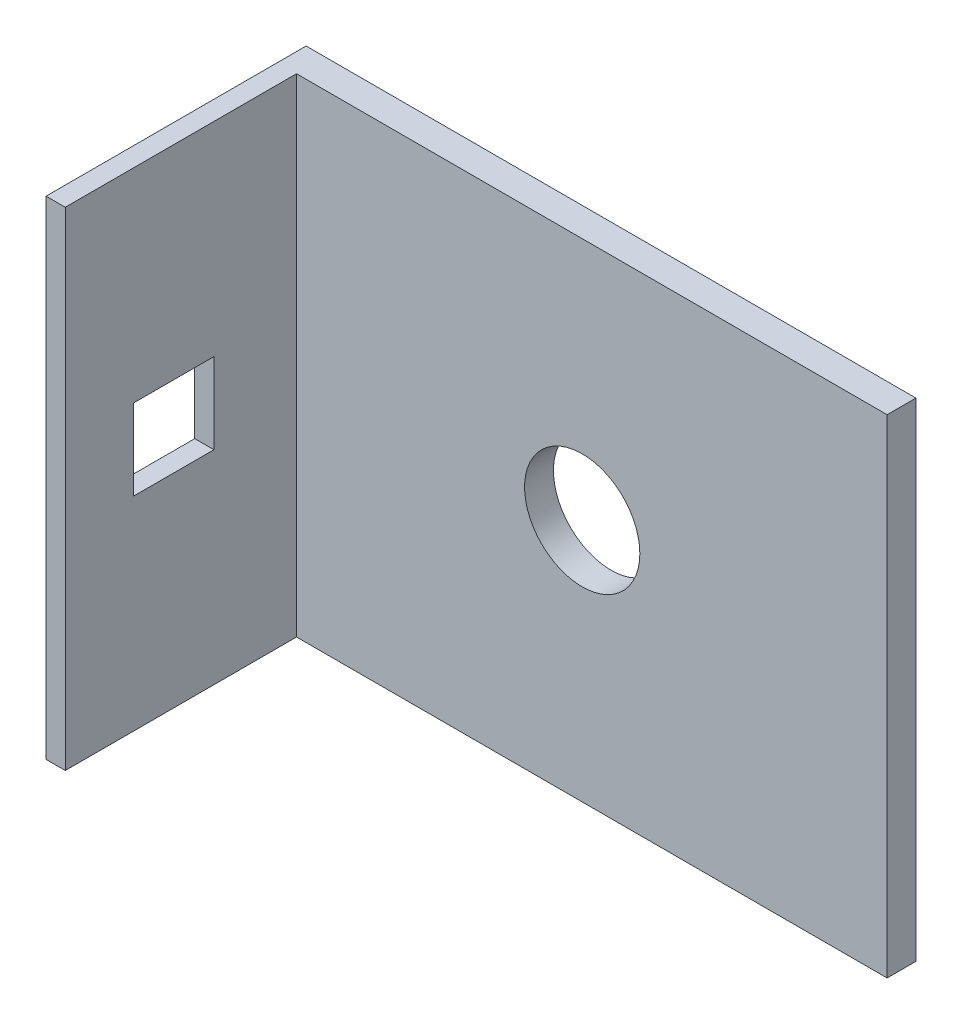
ISO-10303-21;
HEADER;
FILE_DESCRIPTION(('STEP AP214'),'2;1');
FILE_NAME('part.step','',(''),(''),'','','');
FILE_SCHEMA(('AUTOMOTIVE_DESIGN { 1 0 10303 214 1 1 1 1 }'));
ENDSEC;
DATA;
#1=APPLICATION_CONTEXT('core data for automotive mechanical design processes');
#2=APPLICATION_PROTOCOL_DEFINITION('international standard','automotive_design',2000,#1);
#3=PRODUCT_CONTEXT('',#1,'mechanical');
#4=PRODUCT('Part','Part','',(#3));
#5=PRODUCT_RELATED_PRODUCT_CATEGORY('part','',(#4));
#6=PRODUCT_DEFINITION_FORMATION('','',#4);
#7=PRODUCT_DEFINITION_CONTEXT('part definition',#1,'design');
#8=PRODUCT_DEFINITION('design','',#6,#7);
#9=PRODUCT_DEFINITION_SHAPE('','',#8);
#10=(LENGTH_UNIT() NAMED_UNIT(*) SI_UNIT(.MILLI.,.METRE.));
#11=(NAMED_UNIT(*) PLANE_ANGLE_UNIT() SI_UNIT($,.RADIAN.));
#12=(NAMED_UNIT(*) SI_UNIT($,.STERADIAN.) SOLID_ANGLE_UNIT());
#13=UNCERTAINTY_MEASURE_WITH_UNIT(LENGTH_MEASURE(1.E-05),#10,'distance_accuracy_value','');
#14=(GEOMETRIC_REPRESENTATION_CONTEXT(3) GLOBAL_UNCERTAINTY_ASSIGNED_CONTEXT((#13)) GLOBAL_UNIT_ASSIGNED_CONTEXT((#10,
#11,#12)) REPRESENTATION_CONTEXT('',''));
#15=CARTESIAN_POINT('',(0.,0.,0.));
#16=DIRECTION('',(0.,0.,1.));
#17=DIRECTION('',(1.,0.,0.));
#18=AXIS2_PLACEMENT_3D('',#15,#16,#17);
#19=CARTESIAN_POINT('',(0.,0.,3.));
#20=DIRECTION('',(0.,0.,1.));
#21=DIRECTION('',(1.,0.,0.));
#22=AXIS2_PLACEMENT_3D('',#19,#20,#21);
#23=PLANE('',#22);
#24=DIRECTION('',(0.,1.,0.));
#25=VECTOR('',#24,1.);
#26=CARTESIAN_POINT('',(-29.75,25.4,3.));
#27=LINE('',#26,#25);
#28=CARTESIAN_POINT('',(-29.75,-25.4,3.));
#29=VERTEX_POINT('',#28);
#30=CARTESIAN_POINT('',(-29.75,25.4,3.));
#31=VERTEX_POINT('',#30);
#32=EDGE_CURVE('E158',#29,#31,#27,.T.);
#33=ORIENTED_EDGE('',*,*,#32,.F.);
#34=DIRECTION('',(1.,0.,0.));
#35=VECTOR('',#34,1.);
#36=CARTESIAN_POINT('',(-31.75,-25.4,3.));
#37=LINE('',#36,#35);
#38=CARTESIAN_POINT('',(31.75,-25.4,3.));
#39=VERTEX_POINT('',#38);
#40=EDGE_CURVE('E194',#29,#39,#37,.T.);
#41=ORIENTED_EDGE('',*,*,#40,.T.);
#42=DIRECTION('',(0.,1.,0.));
#43=VECTOR('',#42,1.);
#44=CARTESIAN_POINT('',(31.75,25.4,3.));
#45=LINE('',#44,#43);
#46=CARTESIAN_POINT('',(31.75,25.4,3.));
#47=VERTEX_POINT('',#46);
#48=EDGE_CURVE('E197',#39,#47,#45,.T.);
#49=ORIENTED_EDGE('',*,*,#48,.T.);
#50=DIRECTION('',(-1.,0.,0.));
#51=VECTOR('',#50,1.);
#52=CARTESIAN_POINT('',(-31.75,25.4,3.));
#53=LINE('',#52,#51);
#54=EDGE_CURVE('E201',#47,#31,#53,.T.);
#55=ORIENTED_EDGE('',*,*,#54,.T.);
#56=EDGE_LOOP('',(#33,#41,#49,#55));
#57=FACE_BOUND('',#56,.T.);
#58=CARTESIAN_POINT('',(0.,0.,3.));
#59=DIRECTION('',(0.,0.,1.));
#60=DIRECTION('',(1.,0.,0.));
#61=AXIS2_PLACEMENT_3D('',#58,#59,#60);
#62=CIRCLE('',#61,6.);
#63=CARTESIAN_POINT('',(6.,0.,3.));
#64=VERTEX_POINT('',#63);
#65=EDGE_CURVE('E186',#64,#64,#62,.T.);
#66=ORIENTED_EDGE('',*,*,#65,.F.);
#67=EDGE_LOOP('',(#66));
#68=FACE_BOUND('',#67,.T.);
#69=ADVANCED_FACE('F43',(#57,#68),#23,.T.);
#70=CARTESIAN_POINT('',(0.,0.,0.));
#71=DIRECTION('',(0.,0.,1.));
#72=DIRECTION('',(1.,0.,0.));
#73=AXIS2_PLACEMENT_3D('',#70,#71,#72);
#74=PLANE('',#73);
#75=DIRECTION('',(0.,-1.,0.));
#76=VECTOR('',#75,1.);
#77=CARTESIAN_POINT('',(-31.75,25.4,0.));
#78=LINE('',#77,#76);
#79=CARTESIAN_POINT('',(-31.75,25.4,0.));
#80=VERTEX_POINT('',#79);
#81=CARTESIAN_POINT('',(-31.75,-25.4,0.));
#82=VERTEX_POINT('',#81);
#83=EDGE_CURVE('E190',#80,#82,#78,.T.);
#84=ORIENTED_EDGE('',*,*,#83,.F.);
#85=DIRECTION('',(-1.,0.,0.));
#86=VECTOR('',#85,1.);
#87=CARTESIAN_POINT('',(-31.75,25.4,0.));
#88=LINE('',#87,#86);
#89=CARTESIAN_POINT('',(31.75,25.4,0.));
#90=VERTEX_POINT('',#89);
#91=EDGE_CURVE('E198',#90,#80,#88,.T.);
#92=ORIENTED_EDGE('',*,*,#91,.F.);
#93=DIRECTION('',(0.,1.,0.));
#94=VECTOR('',#93,1.);
#95=CARTESIAN_POINT('',(31.75,25.4,0.));
#96=LINE('',#95,#94);
#97=CARTESIAN_POINT('',(31.75,-25.4,0.));
#98=VERTEX_POINT('',#97);
#99=EDGE_CURVE('E211',#98,#90,#96,.T.);
#100=ORIENTED_EDGE('',*,*,#99,.F.);
#101=DIRECTION('',(1.,0.,0.));
#102=VECTOR('',#101,1.);
#103=CARTESIAN_POINT('',(-31.75,-25.4,0.));
#104=LINE('',#103,#102);
#105=EDGE_CURVE('E208',#82,#98,#104,.T.);
#106=ORIENTED_EDGE('',*,*,#105,.F.);
#107=EDGE_LOOP('',(#84,#92,#100,#106));
#108=FACE_BOUND('',#107,.T.);
#109=CARTESIAN_POINT('',(0.,0.,0.));
#110=DIRECTION('',(0.,0.,1.));
#111=DIRECTION('',(1.,0.,0.));
#112=AXIS2_PLACEMENT_3D('',#109,#110,#111);
#113=CIRCLE('',#112,6.);
#114=CARTESIAN_POINT('',(6.,0.,0.));
#115=VERTEX_POINT('',#114);
#116=EDGE_CURVE('E185',#115,#115,#113,.T.);
#117=ORIENTED_EDGE('',*,*,#116,.T.);
#118=EDGE_LOOP('',(#117));
#119=FACE_BOUND('',#118,.T.);
#120=ADVANCED_FACE('F235',(#108,#119),#74,.F.);
#121=CARTESIAN_POINT('',(-31.75,25.4,3.));
#122=DIRECTION('',(1.,0.,0.));
#123=DIRECTION('',(0.,1.,0.));
#124=AXIS2_PLACEMENT_3D('',#121,#122,#123);
#125=PLANE('',#124);
#126=DIRECTION('',(0.,0.,-1.));
#127=VECTOR('',#126,1.);
#128=CARTESIAN_POINT('',(-31.75,4.191,20.));
#129=LINE('',#128,#127);
#130=CARTESIAN_POINT('',(-31.75,4.191,20.));
#131=VERTEX_POINT('',#130);
#132=CARTESIAN_POINT('',(-31.75,4.191,11.6));
#133=VERTEX_POINT('',#132);
#134=EDGE_CURVE('E134',#131,#133,#129,.T.);
#135=ORIENTED_EDGE('',*,*,#134,.F.);
#136=DIRECTION('',(0.,1.,0.));
#137=VECTOR('',#136,1.);
#138=CARTESIAN_POINT('',(-31.75,4.191,20.));
#139=LINE('',#138,#137);
#140=CARTESIAN_POINT('',(-31.75,-4.209,20.));
#141=VERTEX_POINT('',#140);
#142=EDGE_CURVE('E59',#141,#131,#139,.T.);
#143=ORIENTED_EDGE('',*,*,#142,.F.);
#144=DIRECTION('',(0.,0.,1.));
#145=VECTOR('',#144,1.);
#146=CARTESIAN_POINT('',(-31.75,-4.209,20.));
#147=LINE('',#146,#145);
#148=CARTESIAN_POINT('',(-31.75,-4.209,11.6));
#149=VERTEX_POINT('',#148);
#150=EDGE_CURVE('E141',#149,#141,#147,.T.);
#151=ORIENTED_EDGE('',*,*,#150,.F.);
#152=DIRECTION('',(0.,-1.,0.));
#153=VECTOR('',#152,1.);
#154=CARTESIAN_POINT('',(-31.75,4.191,11.6));
#155=LINE('',#154,#153);
#156=EDGE_CURVE('E124',#133,#149,#155,.T.);
#157=ORIENTED_EDGE('',*,*,#156,.F.);
#158=EDGE_LOOP('',(#135,#143,#151,#157));
#159=FACE_BOUND('',#158,.T.);
#160=ORIENTED_EDGE('',*,*,#83,.T.);
#161=DIRECTION('',(0.,0.,-1.));
#162=VECTOR('',#161,1.);
#163=CARTESIAN_POINT('',(-31.75,-25.4,3.));
#164=LINE('',#163,#162);
#165=CARTESIAN_POINT('',(-31.75,-25.4,27.082));
#166=VERTEX_POINT('',#165);
#167=EDGE_CURVE('E11',#166,#82,#164,.T.);
#168=ORIENTED_EDGE('',*,*,#167,.F.);
#169=DIRECTION('',(0.,-1.,0.));
#170=VECTOR('',#169,1.);
#171=CARTESIAN_POINT('',(-31.75,25.4,27.082));
#172=LINE('',#171,#170);
#173=CARTESIAN_POINT('',(-31.75,25.4,27.082));
#174=VERTEX_POINT('',#173);
#175=EDGE_CURVE('E160',#174,#166,#172,.T.);
#176=ORIENTED_EDGE('',*,*,#175,.F.);
#177=DIRECTION('',(0.,0.,-1.));
#178=VECTOR('',#177,1.);
#179=CARTESIAN_POINT('',(-31.75,25.4,3.));
#180=LINE('',#179,#178);
#181=EDGE_CURVE('E204',#174,#80,#180,.T.);
#182=ORIENTED_EDGE('',*,*,#181,.T.);
#183=EDGE_LOOP('',(#160,#168,#176,#182));
#184=FACE_BOUND('',#183,.T.);
#185=ADVANCED_FACE('F45',(#159,#184),#125,.F.);
#186=CARTESIAN_POINT('',(-31.75,-25.4,3.));
#187=DIRECTION('',(0.,1.,0.));
#188=DIRECTION('',(0.,0.,1.));
#189=AXIS2_PLACEMENT_3D('',#186,#187,#188);
#190=PLANE('',#189);
#191=ORIENTED_EDGE('',*,*,#105,.T.);
#192=DIRECTION('',(0.,0.,-1.));
#193=VECTOR('',#192,1.);
#194=CARTESIAN_POINT('',(31.75,-25.4,3.));
#195=LINE('',#194,#193);
#196=EDGE_CURVE('E52',#39,#98,#195,.T.);
#197=ORIENTED_EDGE('',*,*,#196,.F.);
#198=ORIENTED_EDGE('',*,*,#40,.F.);
#199=DIRECTION('',(0.,0.,-1.));
#200=VECTOR('',#199,1.);
#201=CARTESIAN_POINT('',(-29.75,-25.4,27.082));
#202=LINE('',#201,#200);
#203=CARTESIAN_POINT('',(-29.75,-25.4,27.082));
#204=VERTEX_POINT('',#203);
#205=EDGE_CURVE('E181',#204,#29,#202,.T.);
#206=ORIENTED_EDGE('',*,*,#205,.F.);
#207=DIRECTION('',(1.,0.,0.));
#208=VECTOR('',#207,1.);
#209=CARTESIAN_POINT('',(-31.75,-25.4,27.082));
#210=LINE('',#209,#208);
#211=EDGE_CURVE('E164',#166,#204,#210,.T.);
#212=ORIENTED_EDGE('',*,*,#211,.F.);
#213=ORIENTED_EDGE('',*,*,#167,.T.);
#214=EDGE_LOOP('',(#191,#197,#198,#206,#212,#213));
#215=FACE_BOUND('',#214,.T.);
#216=ADVANCED_FACE('F252',(#215),#190,.F.);
#217=CARTESIAN_POINT('',(31.75,25.4,3.));
#218=DIRECTION('',(-1.,0.,0.));
#219=DIRECTION('',(0.,-1.,0.));
#220=AXIS2_PLACEMENT_3D('',#217,#218,#219);
#221=PLANE('',#220);
#222=ORIENTED_EDGE('',*,*,#99,.T.);
#223=DIRECTION('',(0.,0.,-1.));
#224=VECTOR('',#223,1.);
#225=CARTESIAN_POINT('',(31.75,25.4,3.));
#226=LINE('',#225,#224);
#227=EDGE_CURVE('E219',#47,#90,#226,.T.);
#228=ORIENTED_EDGE('',*,*,#227,.F.);
#229=ORIENTED_EDGE('',*,*,#48,.F.);
#230=ORIENTED_EDGE('',*,*,#196,.T.);
#231=EDGE_LOOP('',(#222,#228,#229,#230));
#232=FACE_BOUND('',#231,.T.);
#233=ADVANCED_FACE('F228',(#232),#221,.F.);
#234=CARTESIAN_POINT('',(-31.75,25.4,3.));
#235=DIRECTION('',(0.,-1.,0.));
#236=DIRECTION('',(0.,0.,-1.));
#237=AXIS2_PLACEMENT_3D('',#234,#235,#236);
#238=PLANE('',#237);
#239=ORIENTED_EDGE('',*,*,#91,.T.);
#240=ORIENTED_EDGE('',*,*,#181,.F.);
#241=DIRECTION('',(-1.,0.,0.));
#242=VECTOR('',#241,1.);
#243=CARTESIAN_POINT('',(-31.75,25.4,27.082));
#244=LINE('',#243,#242);
#245=CARTESIAN_POINT('',(-29.75,25.4,27.082));
#246=VERTEX_POINT('',#245);
#247=EDGE_CURVE('E170',#246,#174,#244,.T.);
#248=ORIENTED_EDGE('',*,*,#247,.F.);
#249=DIRECTION('',(0.,0.,-1.));
#250=VECTOR('',#249,1.);
#251=CARTESIAN_POINT('',(-29.75,25.4,27.082));
#252=LINE('',#251,#250);
#253=EDGE_CURVE('E174',#246,#31,#252,.T.);
#254=ORIENTED_EDGE('',*,*,#253,.T.);
#255=ORIENTED_EDGE('',*,*,#54,.F.);
#256=ORIENTED_EDGE('',*,*,#227,.T.);
#257=EDGE_LOOP('',(#239,#240,#248,#254,#255,#256));
#258=FACE_BOUND('',#257,.T.);
#259=ADVANCED_FACE('F238',(#258),#238,.F.);
#260=CARTESIAN_POINT('',(0.,0.,3.));
#261=DIRECTION('',(0.,0.,-1.));
#262=DIRECTION('',(-1.,0.,0.));
#263=AXIS2_PLACEMENT_3D('',#260,#261,#262);
#264=CYLINDRICAL_SURFACE('',#263,6.);
#265=ORIENTED_EDGE('',*,*,#65,.T.);
#266=EDGE_LOOP('',(#265));
#267=FACE_BOUND('',#266,.T.);
#268=ORIENTED_EDGE('',*,*,#116,.F.);
#269=EDGE_LOOP('',(#268));
#270=FACE_BOUND('',#269,.T.);
#271=ADVANCED_FACE('F266',(#267,#270),#264,.F.);
#272=CARTESIAN_POINT('',(-29.75,25.4,27.082));
#273=DIRECTION('',(-1.,0.,0.));
#274=DIRECTION('',(0.,-1.,0.));
#275=AXIS2_PLACEMENT_3D('',#272,#273,#274);
#276=PLANE('',#275);
#277=DIRECTION('',(0.,0.,-1.));
#278=VECTOR('',#277,1.);
#279=CARTESIAN_POINT('',(-29.75,-4.209,20.));
#280=LINE('',#279,#278);
#281=CARTESIAN_POINT('',(-29.75,-4.209,20.));
#282=VERTEX_POINT('',#281);
#283=CARTESIAN_POINT('',(-29.75,-4.209,11.6));
#284=VERTEX_POINT('',#283);
#285=EDGE_CURVE('E300',#282,#284,#280,.T.);
#286=ORIENTED_EDGE('',*,*,#285,.F.);
#287=DIRECTION('',(0.,-1.,0.));
#288=VECTOR('',#287,1.);
#289=CARTESIAN_POINT('',(-29.75,4.191,20.));
#290=LINE('',#289,#288);
#291=CARTESIAN_POINT('',(-29.75,4.191,20.));
#292=VERTEX_POINT('',#291);
#293=EDGE_CURVE('E159',#292,#282,#290,.T.);
#294=ORIENTED_EDGE('',*,*,#293,.F.);
#295=DIRECTION('',(0.,0.,1.));
#296=VECTOR('',#295,1.);
#297=CARTESIAN_POINT('',(-29.75,4.191,20.));
#298=LINE('',#297,#296);
#299=CARTESIAN_POINT('',(-29.75,4.191,11.6));
#300=VERTEX_POINT('',#299);
#301=EDGE_CURVE('E155',#300,#292,#298,.T.);
#302=ORIENTED_EDGE('',*,*,#301,.F.);
#303=DIRECTION('',(0.,1.,0.));
#304=VECTOR('',#303,1.);
#305=CARTESIAN_POINT('',(-29.75,4.191,11.6));
#306=LINE('',#305,#304);
#307=EDGE_CURVE('E127',#284,#300,#306,.T.);
#308=ORIENTED_EDGE('',*,*,#307,.F.);
#309=EDGE_LOOP('',(#286,#294,#302,#308));
#310=FACE_BOUND('',#309,.T.);
#311=ORIENTED_EDGE('',*,*,#32,.T.);
#312=ORIENTED_EDGE('',*,*,#253,.F.);
#313=DIRECTION('',(0.,1.,0.));
#314=VECTOR('',#313,1.);
#315=CARTESIAN_POINT('',(-29.75,25.4,27.082));
#316=LINE('',#315,#314);
#317=EDGE_CURVE('E167',#204,#246,#316,.T.);
#318=ORIENTED_EDGE('',*,*,#317,.F.);
#319=ORIENTED_EDGE('',*,*,#205,.T.);
#320=EDGE_LOOP('',(#311,#312,#318,#319));
#321=FACE_BOUND('',#320,.T.);
#322=ADVANCED_FACE('F249',(#310,#321),#276,.F.);
#323=CARTESIAN_POINT('',(0.,0.,27.082));
#324=DIRECTION('',(0.,0.,1.));
#325=DIRECTION('',(1.,0.,0.));
#326=AXIS2_PLACEMENT_3D('',#323,#324,#325);
#327=PLANE('',#326);
#328=ORIENTED_EDGE('',*,*,#175,.T.);
#329=ORIENTED_EDGE('',*,*,#211,.T.);
#330=ORIENTED_EDGE('',*,*,#317,.T.);
#331=ORIENTED_EDGE('',*,*,#247,.T.);
#332=EDGE_LOOP('',(#328,#329,#330,#331));
#333=FACE_BOUND('',#332,.T.);
#334=ADVANCED_FACE('F244',(#333),#327,.T.);
#335=CARTESIAN_POINT('',(-17.870606076066,4.191,20.));
#336=DIRECTION('',(0.,0.,1.));
#337=DIRECTION('',(1.,0.,0.));
#338=AXIS2_PLACEMENT_3D('',#335,#336,#337);
#339=PLANE('',#338);
#340=ORIENTED_EDGE('',*,*,#293,.T.);
#341=DIRECTION('',(-1.,0.,0.));
#342=VECTOR('',#341,1.);
#343=CARTESIAN_POINT('',(-17.870606076066,-4.209,20.));
#344=LINE('',#343,#342);
#345=EDGE_CURVE('E148',#282,#141,#344,.T.);
#346=ORIENTED_EDGE('',*,*,#345,.T.);
#347=ORIENTED_EDGE('',*,*,#142,.T.);
#348=DIRECTION('',(-1.,0.,0.));
#349=VECTOR('',#348,1.);
#350=CARTESIAN_POINT('',(-17.870606076066,4.191,20.));
#351=LINE('',#350,#349);
#352=EDGE_CURVE('E131',#292,#131,#351,.T.);
#353=ORIENTED_EDGE('',*,*,#352,.F.);
#354=EDGE_LOOP('',(#340,#346,#347,#353));
#355=FACE_BOUND('',#354,.T.);
#356=ADVANCED_FACE('F284',(#355),#339,.F.);
#357=CARTESIAN_POINT('',(-17.870606076066,-4.209,20.));
#358=DIRECTION('',(0.,-1.,0.));
#359=DIRECTION('',(1.,0.,0.));
#360=AXIS2_PLACEMENT_3D('',#357,#358,#359);
#361=PLANE('',#360);
#362=ORIENTED_EDGE('',*,*,#285,.T.);
#363=DIRECTION('',(-1.,0.,0.));
#364=VECTOR('',#363,1.);
#365=CARTESIAN_POINT('',(-17.870606076066,-4.209,11.6));
#366=LINE('',#365,#364);
#367=EDGE_CURVE('E130',#284,#149,#366,.T.);
#368=ORIENTED_EDGE('',*,*,#367,.T.);
#369=ORIENTED_EDGE('',*,*,#150,.T.);
#370=ORIENTED_EDGE('',*,*,#345,.F.);
#371=EDGE_LOOP('',(#362,#368,#369,#370));
#372=FACE_BOUND('',#371,.T.);
#373=ADVANCED_FACE('F290',(#372),#361,.F.);
#374=CARTESIAN_POINT('',(-17.870606076066,4.191,11.6));
#375=DIRECTION('',(0.,0.,-1.));
#376=DIRECTION('',(0.,1.,0.));
#377=AXIS2_PLACEMENT_3D('',#374,#375,#376);
#378=PLANE('',#377);
#379=ORIENTED_EDGE('',*,*,#307,.T.);
#380=DIRECTION('',(-1.,0.,0.));
#381=VECTOR('',#380,1.);
#382=CARTESIAN_POINT('',(-17.870606076066,4.191,11.6));
#383=LINE('',#382,#381);
#384=EDGE_CURVE('E67',#300,#133,#383,.T.);
#385=ORIENTED_EDGE('',*,*,#384,.T.);
#386=ORIENTED_EDGE('',*,*,#156,.T.);
#387=ORIENTED_EDGE('',*,*,#367,.F.);
#388=EDGE_LOOP('',(#379,#385,#386,#387));
#389=FACE_BOUND('',#388,.T.);
#390=ADVANCED_FACE('F121',(#389),#378,.F.);
#391=CARTESIAN_POINT('',(-17.870606076066,4.191,20.));
#392=DIRECTION('',(0.,1.,0.));
#393=DIRECTION('',(-1.,0.,0.));
#394=AXIS2_PLACEMENT_3D('',#391,#392,#393);
#395=PLANE('',#394);
#396=ORIENTED_EDGE('',*,*,#301,.T.);
#397=ORIENTED_EDGE('',*,*,#352,.T.);
#398=ORIENTED_EDGE('',*,*,#134,.T.);
#399=ORIENTED_EDGE('',*,*,#384,.F.);
#400=EDGE_LOOP('',(#396,#397,#398,#399));
#401=FACE_BOUND('',#400,.T.);
#402=ADVANCED_FACE('F135',(#401),#395,.F.);
#403=CLOSED_SHELL('',(#69,#120,#185,#216,#233,#259,#271,#322,#334,#356,#373,#390,#402));
#404=MANIFOLD_SOLID_BREP('B2',#403);
#405=ADVANCED_BREP_SHAPE_REPRESENTATION('',(#18,#404),#14);
#406=SHAPE_DEFINITION_REPRESENTATION(#9,#405);
ENDSEC;
END-ISO-10303-21;
